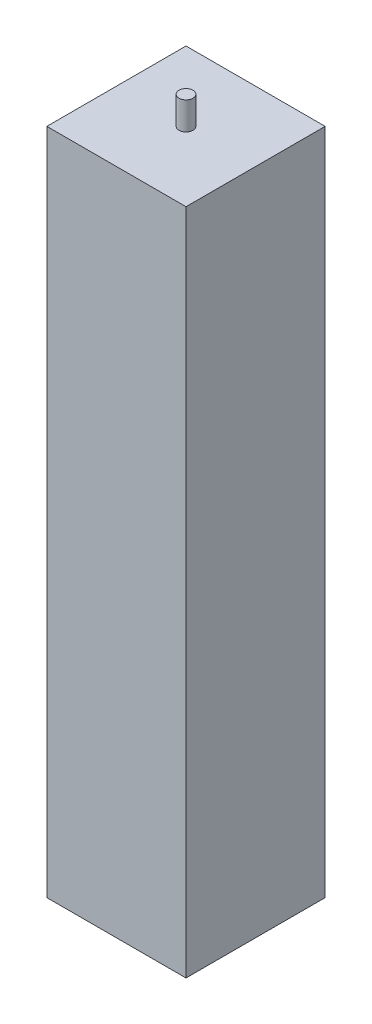
ISO-10303-21;
HEADER;
FILE_DESCRIPTION(('STEP AP214'),'2;1');
FILE_NAME('part.step','',(''),(''),'','','');
FILE_SCHEMA(('AUTOMOTIVE_DESIGN { 1 0 10303 214 1 1 1 1 }'));
ENDSEC;
DATA;
#1=APPLICATION_CONTEXT('core data for automotive mechanical design processes');
#2=APPLICATION_PROTOCOL_DEFINITION('international standard','automotive_design',2000,#1);
#3=PRODUCT_CONTEXT('',#1,'mechanical');
#4=PRODUCT('Part','Part','',(#3));
#5=PRODUCT_RELATED_PRODUCT_CATEGORY('part','',(#4));
#6=PRODUCT_DEFINITION_FORMATION('','',#4);
#7=PRODUCT_DEFINITION_CONTEXT('part definition',#1,'design');
#8=PRODUCT_DEFINITION('design','',#6,#7);
#9=PRODUCT_DEFINITION_SHAPE('','',#8);
#10=(LENGTH_UNIT() NAMED_UNIT(*) SI_UNIT(.MILLI.,.METRE.));
#11=(NAMED_UNIT(*) PLANE_ANGLE_UNIT() SI_UNIT($,.RADIAN.));
#12=(NAMED_UNIT(*) SI_UNIT($,.STERADIAN.) SOLID_ANGLE_UNIT());
#13=UNCERTAINTY_MEASURE_WITH_UNIT(LENGTH_MEASURE(1.E-05),#10,'distance_accuracy_value','');
#14=(GEOMETRIC_REPRESENTATION_CONTEXT(3) GLOBAL_UNCERTAINTY_ASSIGNED_CONTEXT((#13)) GLOBAL_UNIT_ASSIGNED_CONTEXT((#10,
#11,#12)) REPRESENTATION_CONTEXT('',''));
#15=CARTESIAN_POINT('',(0.,0.,0.));
#16=DIRECTION('',(0.,0.,1.));
#17=DIRECTION('',(1.,0.,0.));
#18=AXIS2_PLACEMENT_3D('',#15,#16,#17);
#19=CARTESIAN_POINT('',(-5.,24.,10.));
#20=DIRECTION('',(1.,0.,0.));
#21=DIRECTION('',(0.,1.,0.));
#22=AXIS2_PLACEMENT_3D('',#19,#20,#21);
#23=PLANE('',#22);
#24=DIRECTION('',(0.,-1.,0.));
#25=VECTOR('',#24,1.);
#26=CARTESIAN_POINT('',(-5.,24.,0.));
#27=LINE('',#26,#25);
#28=CARTESIAN_POINT('',(-5.,24.,0.));
#29=VERTEX_POINT('',#28);
#30=CARTESIAN_POINT('',(-5.,-24.,0.));
#31=VERTEX_POINT('',#30);
#32=EDGE_CURVE('E98',#29,#31,#27,.T.);
#33=ORIENTED_EDGE('',*,*,#32,.T.);
#34=DIRECTION('',(0.,0.,-1.));
#35=VECTOR('',#34,1.);
#36=CARTESIAN_POINT('',(-5.,-24.,10.));
#37=LINE('',#36,#35);
#38=CARTESIAN_POINT('',(-5.,-24.,10.));
#39=VERTEX_POINT('',#38);
#40=EDGE_CURVE('E11',#39,#31,#37,.T.);
#41=ORIENTED_EDGE('',*,*,#40,.F.);
#42=DIRECTION('',(0.,-1.,0.));
#43=VECTOR('',#42,1.);
#44=CARTESIAN_POINT('',(-5.,24.,10.));
#45=LINE('',#44,#43);
#46=CARTESIAN_POINT('',(-5.,24.,10.));
#47=VERTEX_POINT('',#46);
#48=EDGE_CURVE('E85',#47,#39,#45,.T.);
#49=ORIENTED_EDGE('',*,*,#48,.F.);
#50=DIRECTION('',(0.,0.,-1.));
#51=VECTOR('',#50,1.);
#52=CARTESIAN_POINT('',(-5.,24.,10.));
#53=LINE('',#52,#51);
#54=EDGE_CURVE('E94',#47,#29,#53,.T.);
#55=ORIENTED_EDGE('',*,*,#54,.T.);
#56=EDGE_LOOP('',(#33,#41,#49,#55));
#57=FACE_BOUND('',#56,.T.);
#58=ADVANCED_FACE('F33',(#57),#23,.F.);
#59=CARTESIAN_POINT('',(-5.,-24.,10.));
#60=DIRECTION('',(0.,1.,0.));
#61=DIRECTION('',(0.,0.,1.));
#62=AXIS2_PLACEMENT_3D('',#59,#60,#61);
#63=PLANE('',#62);
#64=CARTESIAN_POINT('',(0.,-24.,5.));
#65=DIRECTION('',(0.,1.,0.));
#66=DIRECTION('',(0.,0.,1.));
#67=AXIS2_PLACEMENT_3D('',#64,#65,#66);
#68=CIRCLE('',#67,0.500000000000001);
#69=CARTESIAN_POINT('',(0.,-24.,5.5));
#70=VERTEX_POINT('',#69);
#71=EDGE_CURVE('E101',#70,#70,#68,.T.);
#72=ORIENTED_EDGE('',*,*,#71,.T.);
#73=EDGE_LOOP('',(#72));
#74=FACE_BOUND('',#73,.T.);
#75=DIRECTION('',(1.,0.,0.));
#76=VECTOR('',#75,1.);
#77=CARTESIAN_POINT('',(-5.,-24.,0.));
#78=LINE('',#77,#76);
#79=CARTESIAN_POINT('',(5.,-24.,0.));
#80=VERTEX_POINT('',#79);
#81=EDGE_CURVE('E89',#31,#80,#78,.T.);
#82=ORIENTED_EDGE('',*,*,#81,.T.);
#83=DIRECTION('',(0.,0.,-1.));
#84=VECTOR('',#83,1.);
#85=CARTESIAN_POINT('',(5.,-24.,10.));
#86=LINE('',#85,#84);
#87=CARTESIAN_POINT('',(5.,-24.,10.));
#88=VERTEX_POINT('',#87);
#89=EDGE_CURVE('E42',#88,#80,#86,.T.);
#90=ORIENTED_EDGE('',*,*,#89,.F.);
#91=DIRECTION('',(1.,0.,0.));
#92=VECTOR('',#91,1.);
#93=CARTESIAN_POINT('',(-5.,-24.,10.));
#94=LINE('',#93,#92);
#95=EDGE_CURVE('E80',#39,#88,#94,.T.);
#96=ORIENTED_EDGE('',*,*,#95,.F.);
#97=ORIENTED_EDGE('',*,*,#40,.T.);
#98=EDGE_LOOP('',(#82,#90,#96,#97));
#99=FACE_BOUND('',#98,.T.);
#100=ADVANCED_FACE('F88',(#74,#99),#63,.F.);
#101=CARTESIAN_POINT('',(5.00000000000002,24.,10.));
#102=DIRECTION('',(-1.,0.,0.));
#103=DIRECTION('',(0.,-1.,0.));
#104=AXIS2_PLACEMENT_3D('',#101,#102,#103);
#105=PLANE('',#104);
#106=DIRECTION('',(0.,1.,0.));
#107=VECTOR('',#106,1.);
#108=CARTESIAN_POINT('',(5.00000000000002,24.,0.));
#109=LINE('',#108,#107);
#110=CARTESIAN_POINT('',(5.00000000000002,24.,0.));
#111=VERTEX_POINT('',#110);
#112=EDGE_CURVE('E67',#80,#111,#109,.T.);
#113=ORIENTED_EDGE('',*,*,#112,.T.);
#114=DIRECTION('',(0.,0.,-1.));
#115=VECTOR('',#114,1.);
#116=CARTESIAN_POINT('',(5.00000000000002,24.,10.));
#117=LINE('',#116,#115);
#118=CARTESIAN_POINT('',(5.00000000000002,24.,10.));
#119=VERTEX_POINT('',#118);
#120=EDGE_CURVE('E90',#119,#111,#117,.T.);
#121=ORIENTED_EDGE('',*,*,#120,.F.);
#122=DIRECTION('',(0.,1.,0.));
#123=VECTOR('',#122,1.);
#124=CARTESIAN_POINT('',(5.00000000000002,24.,10.));
#125=LINE('',#124,#123);
#126=EDGE_CURVE('E83',#88,#119,#125,.T.);
#127=ORIENTED_EDGE('',*,*,#126,.F.);
#128=ORIENTED_EDGE('',*,*,#89,.T.);
#129=EDGE_LOOP('',(#113,#121,#127,#128));
#130=FACE_BOUND('',#129,.T.);
#131=ADVANCED_FACE('F92',(#130),#105,.F.);
#132=CARTESIAN_POINT('',(-5.,24.,10.));
#133=DIRECTION('',(0.,-1.,0.));
#134=DIRECTION('',(0.,0.,-1.));
#135=AXIS2_PLACEMENT_3D('',#132,#133,#134);
#136=PLANE('',#135);
#137=CARTESIAN_POINT('',(0.,24.,5.));
#138=DIRECTION('',(0.,-1.,0.));
#139=DIRECTION('',(0.,0.,-1.));
#140=AXIS2_PLACEMENT_3D('',#137,#138,#139);
#141=CIRCLE('',#140,0.500000000000001);
#142=CARTESIAN_POINT('',(0.,24.,4.5));
#143=VERTEX_POINT('',#142);
#144=EDGE_CURVE('E36',#143,#143,#141,.T.);
#145=ORIENTED_EDGE('',*,*,#144,.T.);
#146=EDGE_LOOP('',(#145));
#147=FACE_BOUND('',#146,.T.);
#148=DIRECTION('',(-1.,0.,0.));
#149=VECTOR('',#148,1.);
#150=CARTESIAN_POINT('',(-5.,24.,0.));
#151=LINE('',#150,#149);
#152=EDGE_CURVE('E73',#111,#29,#151,.T.);
#153=ORIENTED_EDGE('',*,*,#152,.T.);
#154=ORIENTED_EDGE('',*,*,#54,.F.);
#155=DIRECTION('',(-1.,0.,0.));
#156=VECTOR('',#155,1.);
#157=CARTESIAN_POINT('',(-5.,24.,10.));
#158=LINE('',#157,#156);
#159=EDGE_CURVE('E50',#119,#47,#158,.T.);
#160=ORIENTED_EDGE('',*,*,#159,.F.);
#161=ORIENTED_EDGE('',*,*,#120,.T.);
#162=EDGE_LOOP('',(#153,#154,#160,#161));
#163=FACE_BOUND('',#162,.T.);
#164=ADVANCED_FACE('F106',(#147,#163),#136,.F.);
#165=CARTESIAN_POINT('',(0.,0.,10.));
#166=DIRECTION('',(0.,0.,1.));
#167=DIRECTION('',(1.,0.,0.));
#168=AXIS2_PLACEMENT_3D('',#165,#166,#167);
#169=PLANE('',#168);
#170=ORIENTED_EDGE('',*,*,#48,.T.);
#171=ORIENTED_EDGE('',*,*,#95,.T.);
#172=ORIENTED_EDGE('',*,*,#126,.T.);
#173=ORIENTED_EDGE('',*,*,#159,.T.);
#174=EDGE_LOOP('',(#170,#171,#172,#173));
#175=FACE_BOUND('',#174,.T.);
#176=ADVANCED_FACE('F81',(#175),#169,.T.);
#177=CARTESIAN_POINT('',(0.,0.,0.));
#178=DIRECTION('',(0.,0.,1.));
#179=DIRECTION('',(1.,0.,0.));
#180=AXIS2_PLACEMENT_3D('',#177,#178,#179);
#181=PLANE('',#180);
#182=ORIENTED_EDGE('',*,*,#32,.F.);
#183=ORIENTED_EDGE('',*,*,#152,.F.);
#184=ORIENTED_EDGE('',*,*,#112,.F.);
#185=ORIENTED_EDGE('',*,*,#81,.F.);
#186=EDGE_LOOP('',(#182,#183,#184,#185));
#187=FACE_BOUND('',#186,.T.);
#188=ADVANCED_FACE('F109',(#187),#181,.F.);
#189=CARTESIAN_POINT('',(0.,26.,5.));
#190=DIRECTION('',(0.,1.,0.));
#191=DIRECTION('',(0.,0.,1.));
#192=AXIS2_PLACEMENT_3D('',#189,#190,#191);
#193=PLANE('',#192);
#194=CARTESIAN_POINT('',(0.,26.,5.));
#195=DIRECTION('',(0.,1.,0.));
#196=DIRECTION('',(0.,0.,1.));
#197=AXIS2_PLACEMENT_3D('',#194,#195,#196);
#198=CIRCLE('',#197,0.500000000000001);
#199=CARTESIAN_POINT('',(0.,26.,5.5));
#200=VERTEX_POINT('',#199);
#201=EDGE_CURVE('E117',#200,#200,#198,.T.);
#202=ORIENTED_EDGE('',*,*,#201,.T.);
#203=EDGE_LOOP('',(#202));
#204=FACE_BOUND('',#203,.T.);
#205=ADVANCED_FACE('F121',(#204),#193,.T.);
#206=CARTESIAN_POINT('',(0.,-25.5,5.));
#207=DIRECTION('',(0.,1.,0.));
#208=DIRECTION('',(0.,0.,1.));
#209=AXIS2_PLACEMENT_3D('',#206,#207,#208);
#210=CYLINDRICAL_SURFACE('',#209,0.500000000000001);
#211=ORIENTED_EDGE('',*,*,#201,.F.);
#212=EDGE_LOOP('',(#211));
#213=FACE_BOUND('',#212,.T.);
#214=ORIENTED_EDGE('',*,*,#144,.F.);
#215=EDGE_LOOP('',(#214));
#216=FACE_BOUND('',#215,.T.);
#217=ADVANCED_FACE('F123',(#213,#216),#210,.T.);
#218=CARTESIAN_POINT('',(0.,-25.5,5.));
#219=DIRECTION('',(0.,1.,0.));
#220=DIRECTION('',(0.,0.,1.));
#221=AXIS2_PLACEMENT_3D('',#218,#219,#220);
#222=CIRCLE('',#221,0.500000000000001);
#223=CARTESIAN_POINT('',(0.,-25.5,5.5));
#224=VERTEX_POINT('',#223);
#225=EDGE_CURVE('E114',#224,#224,#222,.T.);
#226=ORIENTED_EDGE('',*,*,#225,.T.);
#227=EDGE_LOOP('',(#226));
#228=FACE_BOUND('',#227,.T.);
#229=ORIENTED_EDGE('',*,*,#71,.F.);
#230=EDGE_LOOP('',(#229));
#231=FACE_BOUND('',#230,.T.);
#232=ADVANCED_FACE('F126',(#228,#231),#210,.T.);
#233=CARTESIAN_POINT('',(0.,-25.5,5.));
#234=DIRECTION('',(0.,1.,0.));
#235=DIRECTION('',(0.,0.,1.));
#236=AXIS2_PLACEMENT_3D('',#233,#234,#235);
#237=PLANE('',#236);
#238=ORIENTED_EDGE('',*,*,#225,.F.);
#239=EDGE_LOOP('',(#238));
#240=FACE_BOUND('',#239,.T.);
#241=ADVANCED_FACE('F150',(#240),#237,.F.);
#242=CLOSED_SHELL('',(#58,#100,#131,#164,#176,#188,#205,#217,#232,#241));
#243=MANIFOLD_SOLID_BREP('B2',#242);
#244=ADVANCED_BREP_SHAPE_REPRESENTATION('',(#18,#243),#14);
#245=SHAPE_DEFINITION_REPRESENTATION(#9,#244);
ENDSEC;
END-ISO-10303-21;
